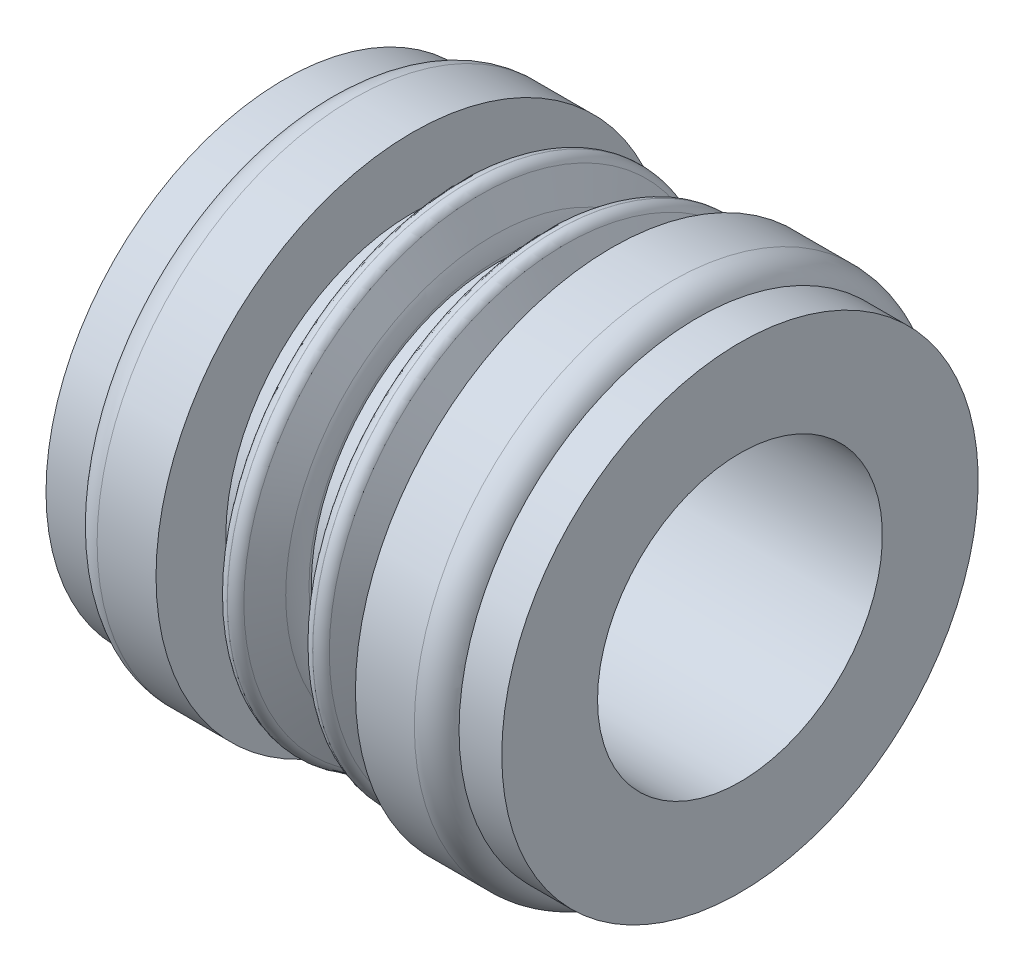
ISO-10303-21;
HEADER;
FILE_DESCRIPTION(('STEP AP214'),'2;1');
FILE_NAME('part.step','',(''),(''),'','','');
FILE_SCHEMA(('AUTOMOTIVE_DESIGN { 1 0 10303 214 1 1 1 1 }'));
ENDSEC;
DATA;
#1=APPLICATION_CONTEXT('core data for automotive mechanical design processes');
#2=APPLICATION_PROTOCOL_DEFINITION('international standard','automotive_design',2000,#1);
#3=PRODUCT_CONTEXT('',#1,'mechanical');
#4=PRODUCT('Part','Part','',(#3));
#5=PRODUCT_RELATED_PRODUCT_CATEGORY('part','',(#4));
#6=PRODUCT_DEFINITION_FORMATION('','',#4);
#7=PRODUCT_DEFINITION_CONTEXT('part definition',#1,'design');
#8=PRODUCT_DEFINITION('design','',#6,#7);
#9=PRODUCT_DEFINITION_SHAPE('','',#8);
#10=(LENGTH_UNIT() NAMED_UNIT(*) SI_UNIT(.MILLI.,.METRE.));
#11=(NAMED_UNIT(*) PLANE_ANGLE_UNIT() SI_UNIT($,.RADIAN.));
#12=(NAMED_UNIT(*) SI_UNIT($,.STERADIAN.) SOLID_ANGLE_UNIT());
#13=UNCERTAINTY_MEASURE_WITH_UNIT(LENGTH_MEASURE(1.E-05),#10,'distance_accuracy_value','');
#14=(GEOMETRIC_REPRESENTATION_CONTEXT(3) GLOBAL_UNCERTAINTY_ASSIGNED_CONTEXT((#13)) GLOBAL_UNIT_ASSIGNED_CONTEXT((#10,
#11,#12)) REPRESENTATION_CONTEXT('',''));
#15=CARTESIAN_POINT('',(0.,0.,0.));
#16=DIRECTION('',(0.,0.,1.));
#17=DIRECTION('',(1.,0.,0.));
#18=AXIS2_PLACEMENT_3D('',#15,#16,#17);
#19=CARTESIAN_POINT('',(-8.,0.,-5.));
#20=DIRECTION('',(1.,0.,0.));
#21=DIRECTION('',(0.,0.,-1.));
#22=AXIS2_PLACEMENT_3D('',#19,#20,#21);
#23=PLANE('',#22);
#24=CARTESIAN_POINT('',(-8.,0.,0.));
#25=DIRECTION('',(-1.,0.,0.));
#26=DIRECTION('',(0.,0.,1.));
#27=AXIS2_PLACEMENT_3D('',#24,#25,#26);
#28=CIRCLE('',#27,5.);
#29=CARTESIAN_POINT('',(-8.,0.,5.));
#30=VERTEX_POINT('',#29);
#31=EDGE_CURVE('E143',#30,#30,#28,.T.);
#32=ORIENTED_EDGE('',*,*,#31,.F.);
#33=EDGE_LOOP('',(#32));
#34=FACE_BOUND('',#33,.T.);
#35=CARTESIAN_POINT('',(-8.,0.,0.));
#36=DIRECTION('',(-1.,0.,0.));
#37=DIRECTION('',(0.,0.,1.));
#38=AXIS2_PLACEMENT_3D('',#35,#36,#37);
#39=CIRCLE('',#38,8.3622385713636);
#40=CARTESIAN_POINT('',(-8.,0.,8.3622385713636));
#41=VERTEX_POINT('',#40);
#42=EDGE_CURVE('E10',#41,#41,#39,.T.);
#43=ORIENTED_EDGE('',*,*,#42,.T.);
#44=EDGE_LOOP('',(#43));
#45=FACE_BOUND('',#44,.T.);
#46=ADVANCED_FACE('F43',(#34,#45),#23,.F.);
#47=CARTESIAN_POINT('',(-34.5904761904762,0.,0.));
#48=DIRECTION('',(-1.,0.,0.));
#49=DIRECTION('',(0.,0.,1.));
#50=AXIS2_PLACEMENT_3D('',#47,#48,#49);
#51=CYLINDRICAL_SURFACE('',#50,8.3622385713636);
#52=ORIENTED_EDGE('',*,*,#42,.F.);
#53=EDGE_LOOP('',(#52));
#54=FACE_BOUND('',#53,.T.);
#55=CARTESIAN_POINT('',(-6.5,0.,0.));
#56=DIRECTION('',(-1.,0.,0.));
#57=DIRECTION('',(0.,0.,1.));
#58=AXIS2_PLACEMENT_3D('',#55,#56,#57);
#59=CIRCLE('',#58,8.3622385713636);
#60=CARTESIAN_POINT('',(-6.5,0.,8.3622385713636));
#61=VERTEX_POINT('',#60);
#62=EDGE_CURVE('E49',#61,#61,#59,.T.);
#63=ORIENTED_EDGE('',*,*,#62,.T.);
#64=EDGE_LOOP('',(#63));
#65=FACE_BOUND('',#64,.T.);
#66=ADVANCED_FACE('F150',(#54,#65),#51,.T.);
#67=CARTESIAN_POINT('',(-5.56791458684493,0.,0.));
#68=DIRECTION('',(-1.,0.,0.));
#69=DIRECTION('',(0.,0.,1.));
#70=AXIS2_PLACEMENT_3D('',#67,#68,#69);
#71=TOROIDAL_SURFACE('',#70,8.,0.999999999999999);
#72=ORIENTED_EDGE('',*,*,#62,.F.);
#73=EDGE_LOOP('',(#72));
#74=FACE_BOUND('',#73,.T.);
#75=CARTESIAN_POINT('',(-5.56791458684493,0.,0.));
#76=DIRECTION('',(-1.,0.,0.));
#77=DIRECTION('',(0.,0.,1.));
#78=AXIS2_PLACEMENT_3D('',#75,#76,#77);
#79=CIRCLE('',#78,9.);
#80=CARTESIAN_POINT('',(-5.56791458684493,0.,9.));
#81=VERTEX_POINT('',#80);
#82=EDGE_CURVE('E53',#81,#81,#79,.T.);
#83=ORIENTED_EDGE('',*,*,#82,.T.);
#84=EDGE_LOOP('',(#83));
#85=FACE_BOUND('',#84,.T.);
#86=ADVANCED_FACE('F154',(#74,#85),#71,.T.);
#87=CARTESIAN_POINT('',(-34.5904761904762,0.,0.));
#88=DIRECTION('',(-1.,0.,0.));
#89=DIRECTION('',(0.,0.,1.));
#90=AXIS2_PLACEMENT_3D('',#87,#88,#89);
#91=CYLINDRICAL_SURFACE('',#90,9.);
#92=ORIENTED_EDGE('',*,*,#82,.F.);
#93=EDGE_LOOP('',(#92));
#94=FACE_BOUND('',#93,.T.);
#95=CARTESIAN_POINT('',(-3.5,0.,0.));
#96=DIRECTION('',(-1.,0.,0.));
#97=DIRECTION('',(0.,0.,1.));
#98=AXIS2_PLACEMENT_3D('',#95,#96,#97);
#99=CIRCLE('',#98,9.);
#100=CARTESIAN_POINT('',(-3.5,0.,9.));
#101=VERTEX_POINT('',#100);
#102=EDGE_CURVE('E57',#101,#101,#99,.T.);
#103=ORIENTED_EDGE('',*,*,#102,.T.);
#104=EDGE_LOOP('',(#103));
#105=FACE_BOUND('',#104,.T.);
#106=ADVANCED_FACE('F159',(#94,#105),#91,.T.);
#107=CARTESIAN_POINT('',(-3.5,0.,-9.));
#108=DIRECTION('',(-1.,0.,0.));
#109=DIRECTION('',(0.,0.,1.));
#110=AXIS2_PLACEMENT_3D('',#107,#108,#109);
#111=PLANE('',#110);
#112=ORIENTED_EDGE('',*,*,#102,.F.);
#113=EDGE_LOOP('',(#112));
#114=FACE_BOUND('',#113,.T.);
#115=CARTESIAN_POINT('',(-3.5,0.,0.));
#116=DIRECTION('',(-1.,0.,0.));
#117=DIRECTION('',(0.,0.,1.));
#118=AXIS2_PLACEMENT_3D('',#115,#116,#117);
#119=CIRCLE('',#118,6.55);
#120=CARTESIAN_POINT('',(-3.5,0.,6.55));
#121=VERTEX_POINT('',#120);
#122=EDGE_CURVE('E62',#121,#121,#119,.T.);
#123=ORIENTED_EDGE('',*,*,#122,.T.);
#124=EDGE_LOOP('',(#123));
#125=FACE_BOUND('',#124,.T.);
#126=ADVANCED_FACE('F165',(#114,#125),#111,.F.);
#127=CARTESIAN_POINT('',(-34.5904761904762,0.,0.));
#128=DIRECTION('',(-1.,0.,0.));
#129=DIRECTION('',(0.,0.,1.));
#130=AXIS2_PLACEMENT_3D('',#127,#128,#129);
#131=CYLINDRICAL_SURFACE('',#130,6.55);
#132=ORIENTED_EDGE('',*,*,#122,.F.);
#133=EDGE_LOOP('',(#132));
#134=FACE_BOUND('',#133,.T.);
#135=CARTESIAN_POINT('',(-2.5,0.,0.));
#136=DIRECTION('',(-1.,0.,0.));
#137=DIRECTION('',(0.,0.,1.));
#138=AXIS2_PLACEMENT_3D('',#135,#136,#137);
#139=CIRCLE('',#138,6.55);
#140=CARTESIAN_POINT('',(-2.5,0.,6.55));
#141=VERTEX_POINT('',#140);
#142=EDGE_CURVE('E65',#141,#141,#139,.T.);
#143=ORIENTED_EDGE('',*,*,#142,.T.);
#144=EDGE_LOOP('',(#143));
#145=FACE_BOUND('',#144,.T.);
#146=ADVANCED_FACE('F169',(#134,#145),#131,.T.);
#147=CARTESIAN_POINT('',(-2.49999999999999,0.,-6.55));
#148=DIRECTION('',(1.,0.,0.));
#149=DIRECTION('',(0.,0.,-1.));
#150=AXIS2_PLACEMENT_3D('',#147,#148,#149);
#151=PLANE('',#150);
#152=ORIENTED_EDGE('',*,*,#142,.F.);
#153=EDGE_LOOP('',(#152));
#154=FACE_BOUND('',#153,.T.);
#155=CARTESIAN_POINT('',(-2.49999999999998,0.,0.));
#156=DIRECTION('',(-1.,0.,0.));
#157=DIRECTION('',(0.,0.,1.));
#158=AXIS2_PLACEMENT_3D('',#155,#156,#157);
#159=CIRCLE('',#158,6.62933303889999);
#160=CARTESIAN_POINT('',(-2.49999999999998,0.,6.62933303889999));
#161=VERTEX_POINT('',#160);
#162=EDGE_CURVE('E68',#161,#161,#159,.T.);
#163=ORIENTED_EDGE('',*,*,#162,.T.);
#164=EDGE_LOOP('',(#163));
#165=FACE_BOUND('',#164,.T.);
#166=ADVANCED_FACE('F173',(#154,#165),#151,.F.);
#167=CARTESIAN_POINT('',(-1.,0.,0.));
#168=DIRECTION('',(-1.,0.,0.));
#169=DIRECTION('',(0.,0.,1.));
#170=AXIS2_PLACEMENT_3D('',#167,#168,#169);
#171=TOROIDAL_SURFACE('',#170,6.62933303890004,1.49999999999998);
#172=ORIENTED_EDGE('',*,*,#162,.F.);
#173=EDGE_LOOP('',(#172));
#174=FACE_BOUND('',#173,.T.);
#175=CARTESIAN_POINT('',(-2.34532360060502,0.,0.));
#176=DIRECTION('',(-1.,0.,0.));
#177=DIRECTION('',(0.,0.,1.));
#178=AXIS2_PLACEMENT_3D('',#175,#176,#177);
#179=CIRCLE('',#178,7.29273669404151);
#180=CARTESIAN_POINT('',(-2.34532360060502,0.,7.29273669404151));
#181=VERTEX_POINT('',#180);
#182=EDGE_CURVE('E71',#181,#181,#179,.T.);
#183=ORIENTED_EDGE('',*,*,#182,.T.);
#184=EDGE_LOOP('',(#183));
#185=FACE_BOUND('',#184,.T.);
#186=ADVANCED_FACE('F177',(#174,#185),#171,.T.);
#187=CARTESIAN_POINT('',(-1.86001091936692,0.,0.));
#188=DIRECTION('',(1.,0.,0.));
#189=DIRECTION('',(0.,0.,-1.));
#190=AXIS2_PLACEMENT_3D('',#187,#188,#189);
#191=CONICAL_SURFACE('',#190,8.27690764137107,1.11266923701487);
#192=ORIENTED_EDGE('',*,*,#182,.F.);
#193=EDGE_LOOP('',(#192));
#194=FACE_BOUND('',#193,.T.);
#195=CARTESIAN_POINT('',(-1.86001091936692,0.,0.));
#196=DIRECTION('',(-1.,0.,0.));
#197=DIRECTION('',(0.,0.,1.));
#198=AXIS2_PLACEMENT_3D('',#195,#196,#197);
#199=CIRCLE('',#198,8.27690764137107);
#200=CARTESIAN_POINT('',(-1.86001091936692,0.,8.27690764137107));
#201=VERTEX_POINT('',#200);
#202=EDGE_CURVE('E74',#201,#201,#199,.T.);
#203=ORIENTED_EDGE('',*,*,#202,.T.);
#204=EDGE_LOOP('',(#203));
#205=FACE_BOUND('',#204,.T.);
#206=ADVANCED_FACE('F181',(#194,#205),#191,.T.);
#207=CARTESIAN_POINT('',(-1.50125795920558,0.,0.));
#208=DIRECTION('',(-1.,0.,0.));
#209=DIRECTION('',(0.,0.,1.));
#210=AXIS2_PLACEMENT_3D('',#207,#208,#209);
#211=TOROIDAL_SURFACE('',#210,8.1,0.399999999999997);
#212=ORIENTED_EDGE('',*,*,#202,.F.);
#213=EDGE_LOOP('',(#212));
#214=FACE_BOUND('',#213,.T.);
#215=CARTESIAN_POINT('',(-1.50125795920558,0.,0.));
#216=DIRECTION('',(-1.,0.,0.));
#217=DIRECTION('',(0.,0.,1.));
#218=AXIS2_PLACEMENT_3D('',#215,#216,#217);
#219=CIRCLE('',#218,8.5);
#220=CARTESIAN_POINT('',(-1.50125795920558,0.,8.5));
#221=VERTEX_POINT('',#220);
#222=EDGE_CURVE('E77',#221,#221,#219,.T.);
#223=ORIENTED_EDGE('',*,*,#222,.T.);
#224=EDGE_LOOP('',(#223));
#225=FACE_BOUND('',#224,.T.);
#226=ADVANCED_FACE('F185',(#214,#225),#211,.T.);
#227=CARTESIAN_POINT('',(-34.5904761904762,0.,0.));
#228=DIRECTION('',(-1.,0.,0.));
#229=DIRECTION('',(0.,0.,1.));
#230=AXIS2_PLACEMENT_3D('',#227,#228,#229);
#231=CYLINDRICAL_SURFACE('',#230,8.5);
#232=ORIENTED_EDGE('',*,*,#222,.F.);
#233=EDGE_LOOP('',(#232));
#234=FACE_BOUND('',#233,.T.);
#235=CARTESIAN_POINT('',(-1.49874204079441,0.,0.));
#236=DIRECTION('',(-1.,0.,0.));
#237=DIRECTION('',(0.,0.,1.));
#238=AXIS2_PLACEMENT_3D('',#235,#236,#237);
#239=CIRCLE('',#238,8.5);
#240=CARTESIAN_POINT('',(-1.49874204079441,0.,8.5));
#241=VERTEX_POINT('',#240);
#242=EDGE_CURVE('E80',#241,#241,#239,.T.);
#243=ORIENTED_EDGE('',*,*,#242,.T.);
#244=EDGE_LOOP('',(#243));
#245=FACE_BOUND('',#244,.T.);
#246=ADVANCED_FACE('F189',(#234,#245),#231,.T.);
#247=CARTESIAN_POINT('',(-1.49874204079441,0.,0.));
#248=DIRECTION('',(-1.,0.,0.));
#249=DIRECTION('',(0.,0.,1.));
#250=AXIS2_PLACEMENT_3D('',#247,#248,#249);
#251=TOROIDAL_SURFACE('',#250,8.1,0.4);
#252=ORIENTED_EDGE('',*,*,#242,.F.);
#253=EDGE_LOOP('',(#252));
#254=FACE_BOUND('',#253,.T.);
#255=CARTESIAN_POINT('',(-1.13998908063308,0.,0.));
#256=DIRECTION('',(-1.,0.,0.));
#257=DIRECTION('',(0.,0.,1.));
#258=AXIS2_PLACEMENT_3D('',#255,#256,#257);
#259=CIRCLE('',#258,8.27690764137108);
#260=CARTESIAN_POINT('',(-1.13998908063308,0.,8.27690764137108));
#261=VERTEX_POINT('',#260);
#262=EDGE_CURVE('E83',#261,#261,#259,.T.);
#263=ORIENTED_EDGE('',*,*,#262,.T.);
#264=EDGE_LOOP('',(#263));
#265=FACE_BOUND('',#264,.T.);
#266=ADVANCED_FACE('F193',(#254,#265),#251,.T.);
#267=CARTESIAN_POINT('',(-0.654676399394982,0.,0.));
#268=DIRECTION('',(-1.,0.,0.));
#269=DIRECTION('',(0.,0.,1.));
#270=AXIS2_PLACEMENT_3D('',#267,#268,#269);
#271=CONICAL_SURFACE('',#270,7.29273669404158,1.11266923701485);
#272=ORIENTED_EDGE('',*,*,#262,.F.);
#273=EDGE_LOOP('',(#272));
#274=FACE_BOUND('',#273,.T.);
#275=CARTESIAN_POINT('',(-0.654676399394982,0.,0.));
#276=DIRECTION('',(-1.,0.,0.));
#277=DIRECTION('',(0.,0.,1.));
#278=AXIS2_PLACEMENT_3D('',#275,#276,#277);
#279=CIRCLE('',#278,7.29273669404158);
#280=CARTESIAN_POINT('',(-0.654676399394982,0.,7.29273669404158));
#281=VERTEX_POINT('',#280);
#282=EDGE_CURVE('E86',#281,#281,#279,.T.);
#283=ORIENTED_EDGE('',*,*,#282,.T.);
#284=EDGE_LOOP('',(#283));
#285=FACE_BOUND('',#284,.T.);
#286=ADVANCED_FACE('F197',(#274,#285),#271,.T.);
#287=CARTESIAN_POINT('',(-2.,0.,0.));
#288=DIRECTION('',(-1.,0.,0.));
#289=DIRECTION('',(0.,0.,1.));
#290=AXIS2_PLACEMENT_3D('',#287,#288,#289);
#291=TOROIDAL_SURFACE('',#290,6.62933303890003,1.5);
#292=ORIENTED_EDGE('',*,*,#282,.F.);
#293=EDGE_LOOP('',(#292));
#294=FACE_BOUND('',#293,.T.);
#295=CARTESIAN_POINT('',(-0.5,0.,0.));
#296=DIRECTION('',(-1.,0.,0.));
#297=DIRECTION('',(0.,0.,1.));
#298=AXIS2_PLACEMENT_3D('',#295,#296,#297);
#299=CIRCLE('',#298,6.62933303890003);
#300=CARTESIAN_POINT('',(-0.5,0.,6.62933303890003));
#301=VERTEX_POINT('',#300);
#302=EDGE_CURVE('E89',#301,#301,#299,.T.);
#303=ORIENTED_EDGE('',*,*,#302,.T.);
#304=EDGE_LOOP('',(#303));
#305=FACE_BOUND('',#304,.T.);
#306=ADVANCED_FACE('F201',(#294,#305),#291,.T.);
#307=CARTESIAN_POINT('',(-0.499999999999999,0.,-6.62933303890003));
#308=DIRECTION('',(-1.,0.,0.));
#309=DIRECTION('',(0.,0.,1.));
#310=AXIS2_PLACEMENT_3D('',#307,#308,#309);
#311=PLANE('',#310);
#312=ORIENTED_EDGE('',*,*,#302,.F.);
#313=EDGE_LOOP('',(#312));
#314=FACE_BOUND('',#313,.T.);
#315=CARTESIAN_POINT('',(-0.5,0.,0.));
#316=DIRECTION('',(-1.,0.,0.));
#317=DIRECTION('',(0.,0.,1.));
#318=AXIS2_PLACEMENT_3D('',#315,#316,#317);
#319=CIRCLE('',#318,6.55);
#320=CARTESIAN_POINT('',(-0.5,0.,6.55));
#321=VERTEX_POINT('',#320);
#322=EDGE_CURVE('E92',#321,#321,#319,.T.);
#323=ORIENTED_EDGE('',*,*,#322,.T.);
#324=EDGE_LOOP('',(#323));
#325=FACE_BOUND('',#324,.T.);
#326=ADVANCED_FACE('F205',(#314,#325),#311,.F.);
#327=CARTESIAN_POINT('',(-34.5904761904762,0.,0.));
#328=DIRECTION('',(-1.,0.,0.));
#329=DIRECTION('',(0.,0.,1.));
#330=AXIS2_PLACEMENT_3D('',#327,#328,#329);
#331=CYLINDRICAL_SURFACE('',#330,6.55);
#332=ORIENTED_EDGE('',*,*,#322,.F.);
#333=EDGE_LOOP('',(#332));
#334=FACE_BOUND('',#333,.T.);
#335=CARTESIAN_POINT('',(0.5,0.,0.));
#336=DIRECTION('',(-1.,0.,0.));
#337=DIRECTION('',(0.,0.,1.));
#338=AXIS2_PLACEMENT_3D('',#335,#336,#337);
#339=CIRCLE('',#338,6.55);
#340=CARTESIAN_POINT('',(0.5,0.,6.55));
#341=VERTEX_POINT('',#340);
#342=EDGE_CURVE('E95',#341,#341,#339,.T.);
#343=ORIENTED_EDGE('',*,*,#342,.T.);
#344=EDGE_LOOP('',(#343));
#345=FACE_BOUND('',#344,.T.);
#346=ADVANCED_FACE('F209',(#334,#345),#331,.T.);
#347=CARTESIAN_POINT('',(0.500000000000001,0.,-6.62933303890003));
#348=DIRECTION('',(1.,0.,0.));
#349=DIRECTION('',(0.,0.,-1.));
#350=AXIS2_PLACEMENT_3D('',#347,#348,#349);
#351=PLANE('',#350);
#352=ORIENTED_EDGE('',*,*,#342,.F.);
#353=EDGE_LOOP('',(#352));
#354=FACE_BOUND('',#353,.T.);
#355=CARTESIAN_POINT('',(0.5,0.,0.));
#356=DIRECTION('',(-1.,0.,0.));
#357=DIRECTION('',(0.,0.,1.));
#358=AXIS2_PLACEMENT_3D('',#355,#356,#357);
#359=CIRCLE('',#358,6.62933303890003);
#360=CARTESIAN_POINT('',(0.5,0.,6.62933303890003));
#361=VERTEX_POINT('',#360);
#362=EDGE_CURVE('E98',#361,#361,#359,.T.);
#363=ORIENTED_EDGE('',*,*,#362,.T.);
#364=EDGE_LOOP('',(#363));
#365=FACE_BOUND('',#364,.T.);
#366=ADVANCED_FACE('F213',(#354,#365),#351,.F.);
#367=CARTESIAN_POINT('',(2.,0.,0.));
#368=DIRECTION('',(-1.,0.,0.));
#369=DIRECTION('',(0.,0.,1.));
#370=AXIS2_PLACEMENT_3D('',#367,#368,#369);
#371=TOROIDAL_SURFACE('',#370,6.62933303890004,1.5);
#372=ORIENTED_EDGE('',*,*,#362,.F.);
#373=EDGE_LOOP('',(#372));
#374=FACE_BOUND('',#373,.T.);
#375=CARTESIAN_POINT('',(0.654676399394989,0.,0.));
#376=DIRECTION('',(-1.,0.,0.));
#377=DIRECTION('',(0.,0.,1.));
#378=AXIS2_PLACEMENT_3D('',#375,#376,#377);
#379=CIRCLE('',#378,7.29273669404158);
#380=CARTESIAN_POINT('',(0.654676399394989,0.,7.29273669404158));
#381=VERTEX_POINT('',#380);
#382=EDGE_CURVE('E101',#381,#381,#379,.T.);
#383=ORIENTED_EDGE('',*,*,#382,.T.);
#384=EDGE_LOOP('',(#383));
#385=FACE_BOUND('',#384,.T.);
#386=ADVANCED_FACE('F217',(#374,#385),#371,.T.);
#387=CARTESIAN_POINT('',(1.13998908063308,0.,0.));
#388=DIRECTION('',(1.,0.,0.));
#389=DIRECTION('',(0.,0.,-1.));
#390=AXIS2_PLACEMENT_3D('',#387,#388,#389);
#391=CONICAL_SURFACE('',#390,8.27690764137108,1.11266923701486);
#392=ORIENTED_EDGE('',*,*,#382,.F.);
#393=EDGE_LOOP('',(#392));
#394=FACE_BOUND('',#393,.T.);
#395=CARTESIAN_POINT('',(1.13998908063308,0.,0.));
#396=DIRECTION('',(-1.,0.,0.));
#397=DIRECTION('',(0.,0.,1.));
#398=AXIS2_PLACEMENT_3D('',#395,#396,#397);
#399=CIRCLE('',#398,8.27690764137108);
#400=CARTESIAN_POINT('',(1.13998908063308,0.,8.27690764137108));
#401=VERTEX_POINT('',#400);
#402=EDGE_CURVE('E104',#401,#401,#399,.T.);
#403=ORIENTED_EDGE('',*,*,#402,.T.);
#404=EDGE_LOOP('',(#403));
#405=FACE_BOUND('',#404,.T.);
#406=ADVANCED_FACE('F221',(#394,#405),#391,.T.);
#407=CARTESIAN_POINT('',(1.49874204079442,0.,0.));
#408=DIRECTION('',(-1.,0.,0.));
#409=DIRECTION('',(0.,0.,1.));
#410=AXIS2_PLACEMENT_3D('',#407,#408,#409);
#411=TOROIDAL_SURFACE('',#410,8.1,0.4);
#412=ORIENTED_EDGE('',*,*,#402,.F.);
#413=EDGE_LOOP('',(#412));
#414=FACE_BOUND('',#413,.T.);
#415=CARTESIAN_POINT('',(1.49874204079441,0.,0.));
#416=DIRECTION('',(-1.,0.,0.));
#417=DIRECTION('',(0.,0.,1.));
#418=AXIS2_PLACEMENT_3D('',#415,#416,#417);
#419=CIRCLE('',#418,8.5);
#420=CARTESIAN_POINT('',(1.49874204079441,0.,8.5));
#421=VERTEX_POINT('',#420);
#422=EDGE_CURVE('E107',#421,#421,#419,.T.);
#423=ORIENTED_EDGE('',*,*,#422,.T.);
#424=EDGE_LOOP('',(#423));
#425=FACE_BOUND('',#424,.T.);
#426=ADVANCED_FACE('F225',(#414,#425),#411,.T.);
#427=CARTESIAN_POINT('',(-34.5904761904762,0.,0.));
#428=DIRECTION('',(-1.,0.,0.));
#429=DIRECTION('',(0.,0.,1.));
#430=AXIS2_PLACEMENT_3D('',#427,#428,#429);
#431=CYLINDRICAL_SURFACE('',#430,8.5);
#432=ORIENTED_EDGE('',*,*,#422,.F.);
#433=EDGE_LOOP('',(#432));
#434=FACE_BOUND('',#433,.T.);
#435=CARTESIAN_POINT('',(1.50125795920559,0.,0.));
#436=DIRECTION('',(-1.,0.,0.));
#437=DIRECTION('',(0.,0.,1.));
#438=AXIS2_PLACEMENT_3D('',#435,#436,#437);
#439=CIRCLE('',#438,8.5);
#440=CARTESIAN_POINT('',(1.50125795920559,0.,8.5));
#441=VERTEX_POINT('',#440);
#442=EDGE_CURVE('E110',#441,#441,#439,.T.);
#443=ORIENTED_EDGE('',*,*,#442,.T.);
#444=EDGE_LOOP('',(#443));
#445=FACE_BOUND('',#444,.T.);
#446=ADVANCED_FACE('F229',(#434,#445),#431,.T.);
#447=CARTESIAN_POINT('',(1.50125795920559,0.,0.));
#448=DIRECTION('',(-1.,0.,0.));
#449=DIRECTION('',(0.,0.,1.));
#450=AXIS2_PLACEMENT_3D('',#447,#448,#449);
#451=TOROIDAL_SURFACE('',#450,8.1,0.4);
#452=ORIENTED_EDGE('',*,*,#442,.F.);
#453=EDGE_LOOP('',(#452));
#454=FACE_BOUND('',#453,.T.);
#455=CARTESIAN_POINT('',(1.86001091936693,0.,0.));
#456=DIRECTION('',(-1.,0.,0.));
#457=DIRECTION('',(0.,0.,1.));
#458=AXIS2_PLACEMENT_3D('',#455,#456,#457);
#459=CIRCLE('',#458,8.27690764137108);
#460=CARTESIAN_POINT('',(1.86001091936693,0.,8.27690764137108));
#461=VERTEX_POINT('',#460);
#462=EDGE_CURVE('E113',#461,#461,#459,.T.);
#463=ORIENTED_EDGE('',*,*,#462,.T.);
#464=EDGE_LOOP('',(#463));
#465=FACE_BOUND('',#464,.T.);
#466=ADVANCED_FACE('F233',(#454,#465),#451,.T.);
#467=CARTESIAN_POINT('',(2.34532360060501,0.,0.));
#468=DIRECTION('',(-1.,0.,0.));
#469=DIRECTION('',(0.,0.,1.));
#470=AXIS2_PLACEMENT_3D('',#467,#468,#469);
#471=CONICAL_SURFACE('',#470,7.29273669404159,1.11266923701485);
#472=ORIENTED_EDGE('',*,*,#462,.F.);
#473=EDGE_LOOP('',(#472));
#474=FACE_BOUND('',#473,.T.);
#475=CARTESIAN_POINT('',(2.34532360060501,0.,0.));
#476=DIRECTION('',(-1.,0.,0.));
#477=DIRECTION('',(0.,0.,1.));
#478=AXIS2_PLACEMENT_3D('',#475,#476,#477);
#479=CIRCLE('',#478,7.29273669404159);
#480=CARTESIAN_POINT('',(2.34532360060501,0.,7.29273669404159));
#481=VERTEX_POINT('',#480);
#482=EDGE_CURVE('E116',#481,#481,#479,.T.);
#483=ORIENTED_EDGE('',*,*,#482,.T.);
#484=EDGE_LOOP('',(#483));
#485=FACE_BOUND('',#484,.T.);
#486=ADVANCED_FACE('F237',(#474,#485),#471,.T.);
#487=CARTESIAN_POINT('',(1.,0.,0.));
#488=DIRECTION('',(-1.,0.,0.));
#489=DIRECTION('',(0.,0.,1.));
#490=AXIS2_PLACEMENT_3D('',#487,#488,#489);
#491=TOROIDAL_SURFACE('',#490,6.62933303890004,1.5);
#492=ORIENTED_EDGE('',*,*,#482,.F.);
#493=EDGE_LOOP('',(#492));
#494=FACE_BOUND('',#493,.T.);
#495=CARTESIAN_POINT('',(2.5,0.,0.));
#496=DIRECTION('',(-1.,0.,0.));
#497=DIRECTION('',(0.,0.,1.));
#498=AXIS2_PLACEMENT_3D('',#495,#496,#497);
#499=CIRCLE('',#498,6.62933303890004);
#500=CARTESIAN_POINT('',(2.5,0.,6.62933303890004));
#501=VERTEX_POINT('',#500);
#502=EDGE_CURVE('E119',#501,#501,#499,.T.);
#503=ORIENTED_EDGE('',*,*,#502,.T.);
#504=EDGE_LOOP('',(#503));
#505=FACE_BOUND('',#504,.T.);
#506=ADVANCED_FACE('F241',(#494,#505),#491,.T.);
#507=CARTESIAN_POINT('',(2.5,0.,-6.55));
#508=DIRECTION('',(-1.,0.,0.));
#509=DIRECTION('',(0.,0.,1.));
#510=AXIS2_PLACEMENT_3D('',#507,#508,#509);
#511=PLANE('',#510);
#512=ORIENTED_EDGE('',*,*,#502,.F.);
#513=EDGE_LOOP('',(#512));
#514=FACE_BOUND('',#513,.T.);
#515=CARTESIAN_POINT('',(2.5,0.,0.));
#516=DIRECTION('',(-1.,0.,0.));
#517=DIRECTION('',(0.,0.,1.));
#518=AXIS2_PLACEMENT_3D('',#515,#516,#517);
#519=CIRCLE('',#518,6.55);
#520=CARTESIAN_POINT('',(2.5,0.,6.55));
#521=VERTEX_POINT('',#520);
#522=EDGE_CURVE('E122',#521,#521,#519,.T.);
#523=ORIENTED_EDGE('',*,*,#522,.T.);
#524=EDGE_LOOP('',(#523));
#525=FACE_BOUND('',#524,.T.);
#526=ADVANCED_FACE('F245',(#514,#525),#511,.F.);
#527=CARTESIAN_POINT('',(-34.5904761904762,0.,0.));
#528=DIRECTION('',(-1.,0.,0.));
#529=DIRECTION('',(0.,0.,1.));
#530=AXIS2_PLACEMENT_3D('',#527,#528,#529);
#531=CYLINDRICAL_SURFACE('',#530,6.55);
#532=ORIENTED_EDGE('',*,*,#522,.F.);
#533=EDGE_LOOP('',(#532));
#534=FACE_BOUND('',#533,.T.);
#535=CARTESIAN_POINT('',(3.5,0.,0.));
#536=DIRECTION('',(-1.,0.,0.));
#537=DIRECTION('',(0.,0.,1.));
#538=AXIS2_PLACEMENT_3D('',#535,#536,#537);
#539=CIRCLE('',#538,6.55);
#540=CARTESIAN_POINT('',(3.5,0.,6.55));
#541=VERTEX_POINT('',#540);
#542=EDGE_CURVE('E125',#541,#541,#539,.T.);
#543=ORIENTED_EDGE('',*,*,#542,.T.);
#544=EDGE_LOOP('',(#543));
#545=FACE_BOUND('',#544,.T.);
#546=ADVANCED_FACE('F249',(#534,#545),#531,.T.);
#547=CARTESIAN_POINT('',(3.5,0.,-9.));
#548=DIRECTION('',(1.,0.,0.));
#549=DIRECTION('',(0.,0.,-1.));
#550=AXIS2_PLACEMENT_3D('',#547,#548,#549);
#551=PLANE('',#550);
#552=ORIENTED_EDGE('',*,*,#542,.F.);
#553=EDGE_LOOP('',(#552));
#554=FACE_BOUND('',#553,.T.);
#555=CARTESIAN_POINT('',(3.5,0.,0.));
#556=DIRECTION('',(-1.,0.,0.));
#557=DIRECTION('',(0.,0.,1.));
#558=AXIS2_PLACEMENT_3D('',#555,#556,#557);
#559=CIRCLE('',#558,9.);
#560=CARTESIAN_POINT('',(3.5,0.,9.));
#561=VERTEX_POINT('',#560);
#562=EDGE_CURVE('E128',#561,#561,#559,.T.);
#563=ORIENTED_EDGE('',*,*,#562,.T.);
#564=EDGE_LOOP('',(#563));
#565=FACE_BOUND('',#564,.T.);
#566=ADVANCED_FACE('F253',(#554,#565),#551,.F.);
#567=CARTESIAN_POINT('',(-34.5904761904762,0.,0.));
#568=DIRECTION('',(-1.,0.,0.));
#569=DIRECTION('',(0.,0.,1.));
#570=AXIS2_PLACEMENT_3D('',#567,#568,#569);
#571=CYLINDRICAL_SURFACE('',#570,9.);
#572=ORIENTED_EDGE('',*,*,#562,.F.);
#573=EDGE_LOOP('',(#572));
#574=FACE_BOUND('',#573,.T.);
#575=CARTESIAN_POINT('',(5.56791458684493,0.,0.));
#576=DIRECTION('',(-1.,0.,0.));
#577=DIRECTION('',(0.,0.,1.));
#578=AXIS2_PLACEMENT_3D('',#575,#576,#577);
#579=CIRCLE('',#578,9.);
#580=CARTESIAN_POINT('',(5.56791458684493,0.,9.));
#581=VERTEX_POINT('',#580);
#582=EDGE_CURVE('E131',#581,#581,#579,.T.);
#583=ORIENTED_EDGE('',*,*,#582,.T.);
#584=EDGE_LOOP('',(#583));
#585=FACE_BOUND('',#584,.T.);
#586=ADVANCED_FACE('F257',(#574,#585),#571,.T.);
#587=CARTESIAN_POINT('',(5.56791458684493,0.,0.));
#588=DIRECTION('',(-1.,0.,0.));
#589=DIRECTION('',(0.,0.,1.));
#590=AXIS2_PLACEMENT_3D('',#587,#588,#589);
#591=TOROIDAL_SURFACE('',#590,8.,1.);
#592=ORIENTED_EDGE('',*,*,#582,.F.);
#593=EDGE_LOOP('',(#592));
#594=FACE_BOUND('',#593,.T.);
#595=CARTESIAN_POINT('',(6.5,0.,0.));
#596=DIRECTION('',(-1.,0.,0.));
#597=DIRECTION('',(0.,0.,1.));
#598=AXIS2_PLACEMENT_3D('',#595,#596,#597);
#599=CIRCLE('',#598,8.3622385713636);
#600=CARTESIAN_POINT('',(6.5,0.,8.3622385713636));
#601=VERTEX_POINT('',#600);
#602=EDGE_CURVE('E134',#601,#601,#599,.T.);
#603=ORIENTED_EDGE('',*,*,#602,.T.);
#604=EDGE_LOOP('',(#603));
#605=FACE_BOUND('',#604,.T.);
#606=ADVANCED_FACE('F261',(#594,#605),#591,.T.);
#607=CARTESIAN_POINT('',(-34.5904761904762,0.,0.));
#608=DIRECTION('',(-1.,0.,0.));
#609=DIRECTION('',(0.,0.,1.));
#610=AXIS2_PLACEMENT_3D('',#607,#608,#609);
#611=CYLINDRICAL_SURFACE('',#610,8.3622385713636);
#612=ORIENTED_EDGE('',*,*,#602,.F.);
#613=EDGE_LOOP('',(#612));
#614=FACE_BOUND('',#613,.T.);
#615=CARTESIAN_POINT('',(8.,0.,0.));
#616=DIRECTION('',(-1.,0.,0.));
#617=DIRECTION('',(0.,0.,1.));
#618=AXIS2_PLACEMENT_3D('',#615,#616,#617);
#619=CIRCLE('',#618,8.3622385713636);
#620=CARTESIAN_POINT('',(8.,0.,8.3622385713636));
#621=VERTEX_POINT('',#620);
#622=EDGE_CURVE('E137',#621,#621,#619,.T.);
#623=ORIENTED_EDGE('',*,*,#622,.T.);
#624=EDGE_LOOP('',(#623));
#625=FACE_BOUND('',#624,.T.);
#626=ADVANCED_FACE('F265',(#614,#625),#611,.T.);
#627=CARTESIAN_POINT('',(8.,0.,-5.));
#628=DIRECTION('',(-1.,0.,0.));
#629=DIRECTION('',(0.,0.,1.));
#630=AXIS2_PLACEMENT_3D('',#627,#628,#629);
#631=PLANE('',#630);
#632=ORIENTED_EDGE('',*,*,#622,.F.);
#633=EDGE_LOOP('',(#632));
#634=FACE_BOUND('',#633,.T.);
#635=CARTESIAN_POINT('',(8.,0.,0.));
#636=DIRECTION('',(-1.,0.,0.));
#637=DIRECTION('',(0.,0.,1.));
#638=AXIS2_PLACEMENT_3D('',#635,#636,#637);
#639=CIRCLE('',#638,5.);
#640=CARTESIAN_POINT('',(8.,0.,5.));
#641=VERTEX_POINT('',#640);
#642=EDGE_CURVE('E140',#641,#641,#639,.T.);
#643=ORIENTED_EDGE('',*,*,#642,.T.);
#644=EDGE_LOOP('',(#643));
#645=FACE_BOUND('',#644,.T.);
#646=ADVANCED_FACE('F269',(#634,#645),#631,.F.);
#647=CARTESIAN_POINT('',(-34.5904761904762,0.,0.));
#648=DIRECTION('',(-1.,0.,0.));
#649=DIRECTION('',(0.,0.,1.));
#650=AXIS2_PLACEMENT_3D('',#647,#648,#649);
#651=CYLINDRICAL_SURFACE('',#650,5.);
#652=ORIENTED_EDGE('',*,*,#642,.F.);
#653=EDGE_LOOP('',(#652));
#654=FACE_BOUND('',#653,.T.);
#655=ORIENTED_EDGE('',*,*,#31,.T.);
#656=EDGE_LOOP('',(#655));
#657=FACE_BOUND('',#656,.T.);
#658=ADVANCED_FACE('F147',(#654,#657),#651,.F.);
#659=CLOSED_SHELL('',(#46,#66,#86,#106,#126,#146,#166,#186,#206,#226,#246,#266,#286,#306,#326,
#346,#366,#386,#406,#426,#446,#466,#486,#506,#526,#546,#566,#586,#606,#626,#646,#658));
#660=MANIFOLD_SOLID_BREP('B2',#659);
#661=ADVANCED_BREP_SHAPE_REPRESENTATION('',(#18,#660),#14);
#662=SHAPE_DEFINITION_REPRESENTATION(#9,#661);
ENDSEC;
END-ISO-10303-21;
